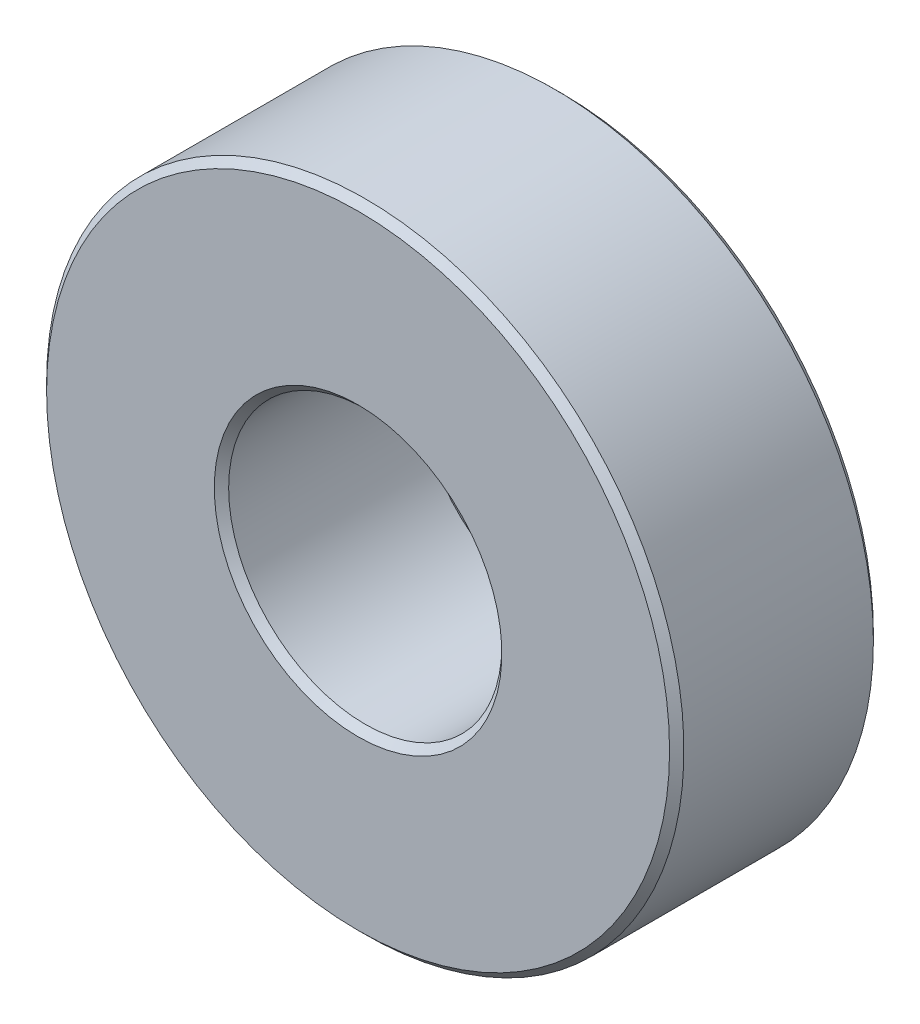
ISO-10303-21;
HEADER;
FILE_DESCRIPTION(('STEP AP214'),'2;1');
FILE_NAME('part.step','',(''),(''),'','','');
FILE_SCHEMA(('AUTOMOTIVE_DESIGN { 1 0 10303 214 1 1 1 1 }'));
ENDSEC;
DATA;
#1=APPLICATION_CONTEXT('core data for automotive mechanical design processes');
#2=APPLICATION_PROTOCOL_DEFINITION('international standard','automotive_design',2000,#1);
#3=PRODUCT_CONTEXT('',#1,'mechanical');
#4=PRODUCT('Part','Part','',(#3));
#5=PRODUCT_RELATED_PRODUCT_CATEGORY('part','',(#4));
#6=PRODUCT_DEFINITION_FORMATION('','',#4);
#7=PRODUCT_DEFINITION_CONTEXT('part definition',#1,'design');
#8=PRODUCT_DEFINITION('design','',#6,#7);
#9=PRODUCT_DEFINITION_SHAPE('','',#8);
#10=(LENGTH_UNIT() NAMED_UNIT(*) SI_UNIT(.MILLI.,.METRE.));
#11=(NAMED_UNIT(*) PLANE_ANGLE_UNIT() SI_UNIT($,.RADIAN.));
#12=(NAMED_UNIT(*) SI_UNIT($,.STERADIAN.) SOLID_ANGLE_UNIT());
#13=UNCERTAINTY_MEASURE_WITH_UNIT(LENGTH_MEASURE(1.E-05),#10,'distance_accuracy_value','');
#14=(GEOMETRIC_REPRESENTATION_CONTEXT(3) GLOBAL_UNCERTAINTY_ASSIGNED_CONTEXT((#13)) GLOBAL_UNIT_ASSIGNED_CONTEXT((#10,
#11,#12)) REPRESENTATION_CONTEXT('',''));
#15=CARTESIAN_POINT('',(0.,0.,0.));
#16=DIRECTION('',(0.,0.,1.));
#17=DIRECTION('',(1.,0.,0.));
#18=AXIS2_PLACEMENT_3D('',#15,#16,#17);
#19=CARTESIAN_POINT('',(0.,0.,0.));
#20=DIRECTION('',(0.,0.,1.));
#21=DIRECTION('',(1.,0.,0.));
#22=AXIS2_PLACEMENT_3D('',#19,#20,#21);
#23=PLANE('',#22);
#24=CARTESIAN_POINT('',(0.,0.,0.));
#25=DIRECTION('',(0.,0.,1.));
#26=DIRECTION('',(1.,0.,0.));
#27=AXIS2_PLACEMENT_3D('',#24,#25,#26);
#28=CIRCLE('',#27,10.865);
#29=CARTESIAN_POINT('',(10.865,0.,0.));
#30=VERTEX_POINT('',#29);
#31=EDGE_CURVE('E18',#30,#30,#28,.T.);
#32=ORIENTED_EDGE('',*,*,#31,.F.);
#33=EDGE_LOOP('',(#32));
#34=FACE_BOUND('',#33,.T.);
#35=CARTESIAN_POINT('',(0.,0.,-5.6843418860808E-11));
#36=DIRECTION('',(0.,0.,-1.));
#37=DIRECTION('',(-1.,0.,0.));
#38=AXIS2_PLACEMENT_3D('',#35,#36,#37);
#39=CIRCLE('',#38,5.01500000007127);
#40=CARTESIAN_POINT('',(-5.01500000007127,0.,-5.6843418860808E-11));
#41=VERTEX_POINT('',#40);
#42=EDGE_CURVE('E32',#41,#41,#39,.F.);
#43=ORIENTED_EDGE('',*,*,#42,.T.);
#44=EDGE_LOOP('',(#43));
#45=FACE_BOUND('',#44,.T.);
#46=ADVANCED_FACE('F15',(#34,#45),#23,.F.);
#47=CARTESIAN_POINT('',(0.,0.,0.250000000000004));
#48=DIRECTION('',(0.,0.,1.));
#49=DIRECTION('',(1.,0.,0.));
#50=AXIS2_PLACEMENT_3D('',#47,#48,#49);
#51=CONICAL_SURFACE('',#50,11.115,0.785398163397449);
#52=ORIENTED_EDGE('',*,*,#31,.T.);
#53=EDGE_LOOP('',(#52));
#54=FACE_BOUND('',#53,.T.);
#55=CARTESIAN_POINT('',(0.,0.,0.250000000000004));
#56=DIRECTION('',(0.,0.,-1.));
#57=DIRECTION('',(-1.,0.,0.));
#58=AXIS2_PLACEMENT_3D('',#55,#56,#57);
#59=CIRCLE('',#58,11.115);
#60=CARTESIAN_POINT('',(-11.115,0.,0.250000000000004));
#61=VERTEX_POINT('',#60);
#62=EDGE_CURVE('E30',#61,#61,#59,.F.);
#63=ORIENTED_EDGE('',*,*,#62,.F.);
#64=EDGE_LOOP('',(#63));
#65=FACE_BOUND('',#64,.T.);
#66=ADVANCED_FACE('F41',(#54,#65),#51,.T.);
#67=CARTESIAN_POINT('',(0.,0.,-5.6843418860808E-11));
#68=DIRECTION('',(0.,0.,-1.));
#69=DIRECTION('',(-1.,0.,0.));
#70=AXIS2_PLACEMENT_3D('',#67,#68,#69);
#71=CONICAL_SURFACE('',#70,5.01500000007127,0.785398163283761);
#72=CARTESIAN_POINT('',(0.,0.,0.249999999994088));
#73=DIRECTION('',(0.,0.,-1.));
#74=DIRECTION('',(-1.,0.,0.));
#75=AXIS2_PLACEMENT_3D('',#72,#73,#74);
#76=CIRCLE('',#75,4.765);
#77=CARTESIAN_POINT('',(-4.765,0.,0.249999999994088));
#78=VERTEX_POINT('',#77);
#79=EDGE_CURVE('E37',#78,#78,#76,.F.);
#80=ORIENTED_EDGE('',*,*,#79,.T.);
#81=EDGE_LOOP('',(#80));
#82=FACE_BOUND('',#81,.T.);
#83=ORIENTED_EDGE('',*,*,#42,.F.);
#84=EDGE_LOOP('',(#83));
#85=FACE_BOUND('',#84,.T.);
#86=ADVANCED_FACE('F49',(#82,#85),#71,.F.);
#87=CARTESIAN_POINT('',(0.,0.,7.11));
#88=DIRECTION('',(0.,0.,-1.));
#89=DIRECTION('',(-1.,0.,0.));
#90=AXIS2_PLACEMENT_3D('',#87,#88,#89);
#91=CYLINDRICAL_SURFACE('',#90,11.115);
#92=CARTESIAN_POINT('',(0.,0.,6.86));
#93=DIRECTION('',(0.,0.,-1.));
#94=DIRECTION('',(-1.,0.,0.));
#95=AXIS2_PLACEMENT_3D('',#92,#93,#94);
#96=CIRCLE('',#95,11.115);
#97=CARTESIAN_POINT('',(-11.115,0.,6.86));
#98=VERTEX_POINT('',#97);
#99=EDGE_CURVE('E81',#98,#98,#96,.F.);
#100=ORIENTED_EDGE('',*,*,#99,.F.);
#101=EDGE_LOOP('',(#100));
#102=FACE_BOUND('',#101,.T.);
#103=ORIENTED_EDGE('',*,*,#62,.T.);
#104=EDGE_LOOP('',(#103));
#105=FACE_BOUND('',#104,.T.);
#106=ADVANCED_FACE('F68',(#102,#105),#91,.T.);
#107=CARTESIAN_POINT('',(0.,0.,7.11));
#108=DIRECTION('',(0.,0.,-1.));
#109=DIRECTION('',(-1.,0.,0.));
#110=AXIS2_PLACEMENT_3D('',#107,#108,#109);
#111=CYLINDRICAL_SURFACE('',#110,4.765);
#112=CARTESIAN_POINT('',(0.,0.,6.85999999996056));
#113=DIRECTION('',(0.,0.,1.));
#114=DIRECTION('',(1.,0.,0.));
#115=AXIS2_PLACEMENT_3D('',#112,#113,#114);
#116=CIRCLE('',#115,4.76499999996349);
#117=CARTESIAN_POINT('',(4.76499999996349,0.,6.85999999996056));
#118=VERTEX_POINT('',#117);
#119=EDGE_CURVE('E27',#118,#118,#116,.T.);
#120=ORIENTED_EDGE('',*,*,#119,.T.);
#121=EDGE_LOOP('',(#120));
#122=FACE_BOUND('',#121,.T.);
#123=ORIENTED_EDGE('',*,*,#79,.F.);
#124=EDGE_LOOP('',(#123));
#125=FACE_BOUND('',#124,.T.);
#126=ADVANCED_FACE('F64',(#122,#125),#111,.F.);
#127=CARTESIAN_POINT('',(0.,0.,6.86));
#128=DIRECTION('',(0.,0.,-1.));
#129=DIRECTION('',(-1.,0.,0.));
#130=AXIS2_PLACEMENT_3D('',#127,#128,#129);
#131=CONICAL_SURFACE('',#130,11.115,0.785398163397442);
#132=CARTESIAN_POINT('',(0.,0.,7.11));
#133=DIRECTION('',(0.,0.,-1.));
#134=DIRECTION('',(-1.,0.,0.));
#135=AXIS2_PLACEMENT_3D('',#132,#133,#134);
#136=CIRCLE('',#135,10.865);
#137=CARTESIAN_POINT('',(-10.865,0.,7.11));
#138=VERTEX_POINT('',#137);
#139=EDGE_CURVE('E22',#138,#138,#136,.F.);
#140=ORIENTED_EDGE('',*,*,#139,.F.);
#141=EDGE_LOOP('',(#140));
#142=FACE_BOUND('',#141,.T.);
#143=ORIENTED_EDGE('',*,*,#99,.T.);
#144=EDGE_LOOP('',(#143));
#145=FACE_BOUND('',#144,.T.);
#146=ADVANCED_FACE('F57',(#142,#145),#131,.T.);
#147=CARTESIAN_POINT('',(0.,0.,7.1100000000115));
#148=DIRECTION('',(0.,0.,1.));
#149=DIRECTION('',(0.,-1.,0.));
#150=AXIS2_PLACEMENT_3D('',#147,#148,#149);
#151=CONICAL_SURFACE('',#150,5.01499999995758,0.785398163283761);
#152=ORIENTED_EDGE('',*,*,#119,.F.);
#153=EDGE_LOOP('',(#152));
#154=FACE_BOUND('',#153,.T.);
#155=CARTESIAN_POINT('',(0.,0.,7.1100000000115));
#156=DIRECTION('',(0.,0.,1.));
#157=DIRECTION('',(0.,-1.,0.));
#158=AXIS2_PLACEMENT_3D('',#155,#156,#157);
#159=CIRCLE('',#158,5.01499999995758);
#160=CARTESIAN_POINT('',(0.,-5.01499999995758,7.1100000000115));
#161=VERTEX_POINT('',#160);
#162=EDGE_CURVE('E10',#161,#161,#159,.F.);
#163=ORIENTED_EDGE('',*,*,#162,.F.);
#164=EDGE_LOOP('',(#163));
#165=FACE_BOUND('',#164,.T.);
#166=ADVANCED_FACE('F52',(#154,#165),#151,.F.);
#167=CARTESIAN_POINT('',(0.,0.,7.11));
#168=DIRECTION('',(0.,0.,1.));
#169=DIRECTION('',(1.,0.,0.));
#170=AXIS2_PLACEMENT_3D('',#167,#168,#169);
#171=PLANE('',#170);
#172=ORIENTED_EDGE('',*,*,#162,.T.);
#173=EDGE_LOOP('',(#172));
#174=FACE_BOUND('',#173,.T.);
#175=ORIENTED_EDGE('',*,*,#139,.T.);
#176=EDGE_LOOP('',(#175));
#177=FACE_BOUND('',#176,.T.);
#178=ADVANCED_FACE('F50',(#174,#177),#171,.T.);
#179=CLOSED_SHELL('',(#46,#66,#86,#106,#126,#146,#166,#178));
#180=MANIFOLD_SOLID_BREP('B1',#179);
#181=ADVANCED_BREP_SHAPE_REPRESENTATION('',(#18,#180),#14);
#182=SHAPE_DEFINITION_REPRESENTATION(#9,#181);
ENDSEC;
END-ISO-10303-21;
